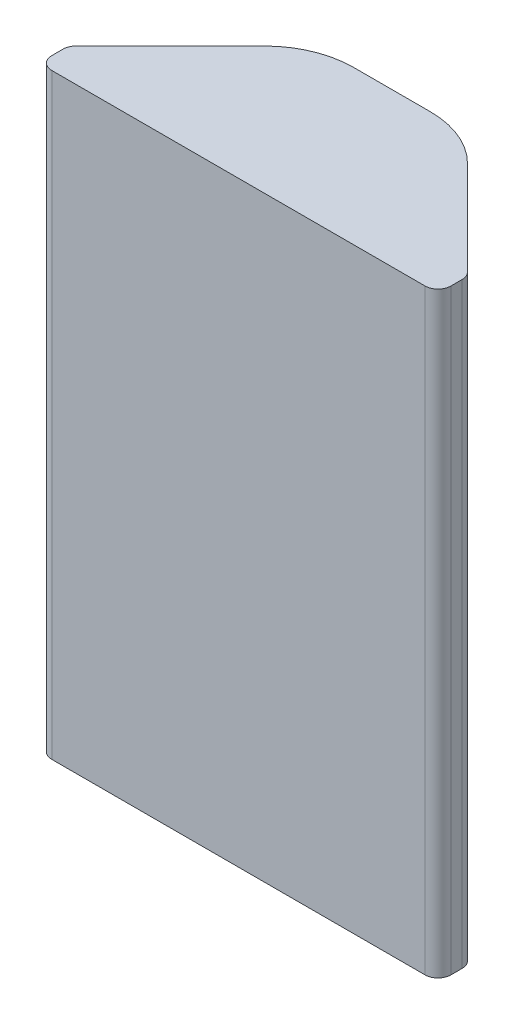
ISO-10303-21;
HEADER;
FILE_DESCRIPTION(('STEP AP214'),'2;1');
FILE_NAME('part.step','',(''),(''),'','','');
FILE_SCHEMA(('AUTOMOTIVE_DESIGN { 1 0 10303 214 1 1 1 1 }'));
ENDSEC;
DATA;
#1=APPLICATION_CONTEXT('core data for automotive mechanical design processes');
#2=APPLICATION_PROTOCOL_DEFINITION('international standard','automotive_design',2000,#1);
#3=PRODUCT_CONTEXT('',#1,'mechanical');
#4=PRODUCT('Part','Part','',(#3));
#5=PRODUCT_RELATED_PRODUCT_CATEGORY('part','',(#4));
#6=PRODUCT_DEFINITION_FORMATION('','',#4);
#7=PRODUCT_DEFINITION_CONTEXT('part definition',#1,'design');
#8=PRODUCT_DEFINITION('design','',#6,#7);
#9=PRODUCT_DEFINITION_SHAPE('','',#8);
#10=(LENGTH_UNIT() NAMED_UNIT(*) SI_UNIT(.MILLI.,.METRE.));
#11=(NAMED_UNIT(*) PLANE_ANGLE_UNIT() SI_UNIT($,.RADIAN.));
#12=(NAMED_UNIT(*) SI_UNIT($,.STERADIAN.) SOLID_ANGLE_UNIT());
#13=UNCERTAINTY_MEASURE_WITH_UNIT(LENGTH_MEASURE(1.E-05),#10,'distance_accuracy_value','');
#14=(GEOMETRIC_REPRESENTATION_CONTEXT(3) GLOBAL_UNCERTAINTY_ASSIGNED_CONTEXT((#13)) GLOBAL_UNIT_ASSIGNED_CONTEXT((#10,
#11,#12)) REPRESENTATION_CONTEXT('',''));
#15=CARTESIAN_POINT('',(0.,0.,0.));
#16=DIRECTION('',(0.,0.,1.));
#17=DIRECTION('',(1.,0.,0.));
#18=AXIS2_PLACEMENT_3D('',#15,#16,#17);
#19=CARTESIAN_POINT('',(9.38534251706032,15.,-4.96569999999972));
#20=DIRECTION('',(0.,-1.,0.));
#21=DIRECTION('',(0.,0.,-1.));
#22=AXIS2_PLACEMENT_3D('',#19,#20,#21);
#23=CYLINDRICAL_SURFACE('',#22,0.647699999999699);
#24=CARTESIAN_POINT('',(9.38534251706032,-15.,-4.96569999999972));
#25=DIRECTION('',(0.,1.,0.));
#26=DIRECTION('',(0.,0.,1.));
#27=AXIS2_PLACEMENT_3D('',#24,#25,#26);
#28=CIRCLE('',#27,0.647699999999699);
#29=CARTESIAN_POINT('',(9.38534251706002,-15.,-4.31800000000002));
#30=VERTEX_POINT('',#29);
#31=CARTESIAN_POINT('',(10.03304251706,-15.,-4.96569999999972));
#32=VERTEX_POINT('',#31);
#33=EDGE_CURVE('E154',#30,#32,#28,.T.);
#34=ORIENTED_EDGE('',*,*,#33,.T.);
#35=DIRECTION('',(0.,-1.,0.));
#36=VECTOR('',#35,1.);
#37=CARTESIAN_POINT('',(10.03304251706,15.,-4.96569999999972));
#38=LINE('',#37,#36);
#39=CARTESIAN_POINT('',(10.03304251706,15.,-4.96569999999972));
#40=VERTEX_POINT('',#39);
#41=EDGE_CURVE('E11',#40,#32,#38,.T.);
#42=ORIENTED_EDGE('',*,*,#41,.F.);
#43=CARTESIAN_POINT('',(9.38534251706032,15.,-4.96569999999972));
#44=DIRECTION('',(0.,1.,0.));
#45=DIRECTION('',(0.,0.,1.));
#46=AXIS2_PLACEMENT_3D('',#43,#44,#45);
#47=CIRCLE('',#46,0.647699999999699);
#48=CARTESIAN_POINT('',(9.38534251706002,15.,-4.31800000000002));
#49=VERTEX_POINT('',#48);
#50=EDGE_CURVE('E177',#49,#40,#47,.T.);
#51=ORIENTED_EDGE('',*,*,#50,.F.);
#52=DIRECTION('',(0.,-1.,0.));
#53=VECTOR('',#52,1.);
#54=CARTESIAN_POINT('',(9.38534251706002,15.,-4.31800000000002));
#55=LINE('',#54,#53);
#56=EDGE_CURVE('E150',#49,#30,#55,.T.);
#57=ORIENTED_EDGE('',*,*,#56,.T.);
#58=EDGE_LOOP('',(#34,#42,#51,#57));
#59=FACE_BOUND('',#58,.T.);
#60=ADVANCED_FACE('F33',(#59),#23,.T.);
#61=CARTESIAN_POINT('',(10.03304251706,15.,-5.53395791189082));
#62=DIRECTION('',(-1.,0.,0.));
#63=DIRECTION('',(0.,0.,1.));
#64=AXIS2_PLACEMENT_3D('',#61,#62,#63);
#65=PLANE('',#64);
#66=DIRECTION('',(0.,0.,-1.));
#67=VECTOR('',#66,1.);
#68=CARTESIAN_POINT('',(10.03304251706,-15.,-5.53395791189082));
#69=LINE('',#68,#67);
#70=CARTESIAN_POINT('',(10.03304251706,-15.,-5.53395791189082));
#71=VERTEX_POINT('',#70);
#72=EDGE_CURVE('E157',#32,#71,#69,.T.);
#73=ORIENTED_EDGE('',*,*,#72,.T.);
#74=DIRECTION('',(0.,-1.,0.));
#75=VECTOR('',#74,1.);
#76=CARTESIAN_POINT('',(10.03304251706,15.,-5.53395791189082));
#77=LINE('',#76,#75);
#78=CARTESIAN_POINT('',(10.03304251706,15.,-5.53395791189082));
#79=VERTEX_POINT('',#78);
#80=EDGE_CURVE('E41',#79,#71,#77,.T.);
#81=ORIENTED_EDGE('',*,*,#80,.F.);
#82=DIRECTION('',(0.,0.,-1.));
#83=VECTOR('',#82,1.);
#84=CARTESIAN_POINT('',(10.03304251706,15.,-5.53395791189082));
#85=LINE('',#84,#83);
#86=EDGE_CURVE('E102',#40,#79,#85,.T.);
#87=ORIENTED_EDGE('',*,*,#86,.F.);
#88=ORIENTED_EDGE('',*,*,#41,.T.);
#89=EDGE_LOOP('',(#73,#81,#87,#88));
#90=FACE_BOUND('',#89,.T.);
#91=ADVANCED_FACE('F245',(#90),#65,.F.);
#92=CARTESIAN_POINT('',(9.38534251706399,15.,-5.53395791189082));
#93=DIRECTION('',(0.,-1.,0.));
#94=DIRECTION('',(0.,0.,-1.));
#95=AXIS2_PLACEMENT_3D('',#92,#93,#94);
#96=CYLINDRICAL_SURFACE('',#95,0.64769999999602);
#97=CARTESIAN_POINT('',(9.38534251706399,-15.,-5.53395791189082));
#98=DIRECTION('',(0.,1.,0.));
#99=DIRECTION('',(0.,0.,1.));
#100=AXIS2_PLACEMENT_3D('',#97,#98,#99);
#101=CIRCLE('',#100,0.64769999999602);
#102=CARTESIAN_POINT('',(9.84333501601026,-15.,-5.99195153728729));
#103=VERTEX_POINT('',#102);
#104=EDGE_CURVE('E159',#71,#103,#101,.T.);
#105=ORIENTED_EDGE('',*,*,#104,.T.);
#106=DIRECTION('',(0.,-1.,0.));
#107=VECTOR('',#106,1.);
#108=CARTESIAN_POINT('',(9.84333501601026,15.,-5.99195153728729));
#109=LINE('',#108,#107);
#110=CARTESIAN_POINT('',(9.84333501601026,15.,-5.99195153728729));
#111=VERTEX_POINT('',#110);
#112=EDGE_CURVE('E196',#111,#103,#109,.T.);
#113=ORIENTED_EDGE('',*,*,#112,.F.);
#114=CARTESIAN_POINT('',(9.38534251706399,15.,-5.53395791189082));
#115=DIRECTION('',(0.,1.,0.));
#116=DIRECTION('',(0.,0.,1.));
#117=AXIS2_PLACEMENT_3D('',#114,#115,#116);
#118=CIRCLE('',#117,0.64769999999602);
#119=EDGE_CURVE('E204',#79,#111,#118,.T.);
#120=ORIENTED_EDGE('',*,*,#119,.F.);
#121=ORIENTED_EDGE('',*,*,#80,.T.);
#122=EDGE_LOOP('',(#105,#113,#120,#121));
#123=FACE_BOUND('',#122,.T.);
#124=ADVANCED_FACE('F202',(#123),#96,.T.);
#125=CARTESIAN_POINT('',(5.11246034125617,15.,-10.7228145763014));
#126=DIRECTION('',(-0.707105911608889,0.,0.707107650763137));
#127=DIRECTION('',(0.707107650763137,0.,0.707105911608889));
#128=AXIS2_PLACEMENT_3D('',#125,#126,#127);
#129=PLANE('',#128);
#130=DIRECTION('',(-0.707107650763137,0.,-0.707105911608889));
#131=VECTOR('',#130,1.);
#132=CARTESIAN_POINT('',(5.11246034125617,-15.,-10.7228145763014));
#133=LINE('',#132,#131);
#134=CARTESIAN_POINT('',(5.11246034125617,-15.,-10.7228145763014));
#135=VERTEX_POINT('',#134);
#136=EDGE_CURVE('E161',#103,#135,#133,.T.);
#137=ORIENTED_EDGE('',*,*,#136,.T.);
#138=DIRECTION('',(0.,-1.,0.));
#139=VECTOR('',#138,1.);
#140=CARTESIAN_POINT('',(5.11246034125617,15.,-10.7228145763014));
#141=LINE('',#140,#139);
#142=CARTESIAN_POINT('',(5.11246034125617,15.,-10.7228145763014));
#143=VERTEX_POINT('',#142);
#144=EDGE_CURVE('E193',#143,#135,#141,.T.);
#145=ORIENTED_EDGE('',*,*,#144,.F.);
#146=DIRECTION('',(-0.707107650763137,0.,-0.707105911608889));
#147=VECTOR('',#146,1.);
#148=CARTESIAN_POINT('',(5.11246034125617,15.,-10.7228145763014));
#149=LINE('',#148,#147);
#150=EDGE_CURVE('E220',#111,#143,#149,.T.);
#151=ORIENTED_EDGE('',*,*,#150,.F.);
#152=ORIENTED_EDGE('',*,*,#112,.T.);
#153=EDGE_LOOP('',(#137,#145,#151,#152));
#154=FACE_BOUND('',#153,.T.);
#155=ADVANCED_FACE('F211',(#154),#129,.F.);
#156=CARTESIAN_POINT('',(1.93345358384597,15.,-7.5438000000015));
#157=DIRECTION('',(0.,-1.,0.));
#158=DIRECTION('',(0.,0.,-1.));
#159=AXIS2_PLACEMENT_3D('',#156,#157,#158);
#160=CYLINDRICAL_SURFACE('',#159,4.49579999999852);
#161=CARTESIAN_POINT('',(1.93345358384597,-15.,-7.5438000000015));
#162=DIRECTION('',(0.,1.,0.));
#163=DIRECTION('',(0.,0.,1.));
#164=AXIS2_PLACEMENT_3D('',#161,#162,#163);
#165=CIRCLE('',#164,4.49579999999852);
#166=CARTESIAN_POINT('',(1.93345358384597,-15.,-12.0396));
#167=VERTEX_POINT('',#166);
#168=EDGE_CURVE('E163',#135,#167,#165,.T.);
#169=ORIENTED_EDGE('',*,*,#168,.T.);
#170=DIRECTION('',(0.,-1.,0.));
#171=VECTOR('',#170,1.);
#172=CARTESIAN_POINT('',(1.93345358384597,15.,-12.0396));
#173=LINE('',#172,#171);
#174=CARTESIAN_POINT('',(1.93345358384597,15.,-12.0396));
#175=VERTEX_POINT('',#174);
#176=EDGE_CURVE('E190',#175,#167,#173,.T.);
#177=ORIENTED_EDGE('',*,*,#176,.F.);
#178=CARTESIAN_POINT('',(1.93345358384597,15.,-7.5438000000015));
#179=DIRECTION('',(0.,1.,0.));
#180=DIRECTION('',(0.,0.,1.));
#181=AXIS2_PLACEMENT_3D('',#178,#179,#180);
#182=CIRCLE('',#181,4.49579999999852);
#183=EDGE_CURVE('E217',#143,#175,#182,.T.);
#184=ORIENTED_EDGE('',*,*,#183,.F.);
#185=ORIENTED_EDGE('',*,*,#144,.T.);
#186=EDGE_LOOP('',(#169,#177,#184,#185));
#187=FACE_BOUND('',#186,.T.);
#188=ADVANCED_FACE('F215',(#187),#160,.T.);
#189=CARTESIAN_POINT('',(-1.93345358384594,15.,-12.0396));
#190=DIRECTION('',(0.,0.,1.));
#191=DIRECTION('',(1.,0.,0.));
#192=AXIS2_PLACEMENT_3D('',#189,#190,#191);
#193=PLANE('',#192);
#194=DIRECTION('',(-1.,0.,0.));
#195=VECTOR('',#194,1.);
#196=CARTESIAN_POINT('',(-1.93345358384594,-15.,-12.0396));
#197=LINE('',#196,#195);
#198=CARTESIAN_POINT('',(-1.93345358384594,-15.,-12.0396));
#199=VERTEX_POINT('',#198);
#200=EDGE_CURVE('E165',#167,#199,#197,.T.);
#201=ORIENTED_EDGE('',*,*,#200,.T.);
#202=DIRECTION('',(0.,-1.,0.));
#203=VECTOR('',#202,1.);
#204=CARTESIAN_POINT('',(-1.93345358384594,15.,-12.0396));
#205=LINE('',#204,#203);
#206=CARTESIAN_POINT('',(-1.93345358384594,15.,-12.0396));
#207=VERTEX_POINT('',#206);
#208=EDGE_CURVE('E187',#207,#199,#205,.T.);
#209=ORIENTED_EDGE('',*,*,#208,.F.);
#210=DIRECTION('',(-1.,0.,0.));
#211=VECTOR('',#210,1.);
#212=CARTESIAN_POINT('',(-1.93345358384594,15.,-12.0396));
#213=LINE('',#212,#211);
#214=EDGE_CURVE('E219',#175,#207,#213,.T.);
#215=ORIENTED_EDGE('',*,*,#214,.F.);
#216=ORIENTED_EDGE('',*,*,#176,.T.);
#217=EDGE_LOOP('',(#201,#209,#215,#216));
#218=FACE_BOUND('',#217,.T.);
#219=ADVANCED_FACE('F257',(#218),#193,.F.);
#220=CARTESIAN_POINT('',(-1.93345358384594,15.,-7.54380000000146));
#221=DIRECTION('',(0.,-1.,0.));
#222=DIRECTION('',(0.,0.,-1.));
#223=AXIS2_PLACEMENT_3D('',#220,#221,#222);
#224=CYLINDRICAL_SURFACE('',#223,4.49579999999856);
#225=CARTESIAN_POINT('',(-1.93345358384594,-15.,-7.54380000000146));
#226=DIRECTION('',(0.,1.,0.));
#227=DIRECTION('',(0.,0.,1.));
#228=AXIS2_PLACEMENT_3D('',#225,#226,#227);
#229=CIRCLE('',#228,4.49579999999856);
#230=CARTESIAN_POINT('',(-5.11246034125617,-15.,-10.7228145763013));
#231=VERTEX_POINT('',#230);
#232=EDGE_CURVE('E167',#199,#231,#229,.T.);
#233=ORIENTED_EDGE('',*,*,#232,.T.);
#234=DIRECTION('',(0.,-1.,0.));
#235=VECTOR('',#234,1.);
#236=CARTESIAN_POINT('',(-5.11246034125617,15.,-10.7228145763013));
#237=LINE('',#236,#235);
#238=CARTESIAN_POINT('',(-5.11246034125617,15.,-10.7228145763013));
#239=VERTEX_POINT('',#238);
#240=EDGE_CURVE('E184',#239,#231,#237,.T.);
#241=ORIENTED_EDGE('',*,*,#240,.F.);
#242=CARTESIAN_POINT('',(-1.93345358384594,15.,-7.54380000000146));
#243=DIRECTION('',(0.,1.,0.));
#244=DIRECTION('',(0.,0.,1.));
#245=AXIS2_PLACEMENT_3D('',#242,#243,#244);
#246=CIRCLE('',#245,4.49579999999856);
#247=EDGE_CURVE('E222',#207,#239,#246,.T.);
#248=ORIENTED_EDGE('',*,*,#247,.F.);
#249=ORIENTED_EDGE('',*,*,#208,.T.);
#250=EDGE_LOOP('',(#233,#241,#248,#249));
#251=FACE_BOUND('',#250,.T.);
#252=ADVANCED_FACE('F260',(#251),#224,.T.);
#253=CARTESIAN_POINT('',(-9.84333501601023,15.,-5.99195153728728));
#254=DIRECTION('',(0.707105911608891,0.,0.707107650763135));
#255=DIRECTION('',(0.707107650763135,0.,-0.707105911608891));
#256=AXIS2_PLACEMENT_3D('',#253,#254,#255);
#257=PLANE('',#256);
#258=DIRECTION('',(-0.707107650763135,0.,0.707105911608891));
#259=VECTOR('',#258,1.);
#260=CARTESIAN_POINT('',(-9.84333501601023,-15.,-5.99195153728728));
#261=LINE('',#260,#259);
#262=CARTESIAN_POINT('',(-9.84333501601023,-15.,-5.99195153728728));
#263=VERTEX_POINT('',#262);
#264=EDGE_CURVE('E169',#231,#263,#261,.T.);
#265=ORIENTED_EDGE('',*,*,#264,.T.);
#266=DIRECTION('',(0.,-1.,0.));
#267=VECTOR('',#266,1.);
#268=CARTESIAN_POINT('',(-9.84333501601023,15.,-5.99195153728728));
#269=LINE('',#268,#267);
#270=CARTESIAN_POINT('',(-9.84333501601023,15.,-5.99195153728728));
#271=VERTEX_POINT('',#270);
#272=EDGE_CURVE('E181',#271,#263,#269,.T.);
#273=ORIENTED_EDGE('',*,*,#272,.F.);
#274=DIRECTION('',(-0.707107650763135,0.,0.707105911608891));
#275=VECTOR('',#274,1.);
#276=CARTESIAN_POINT('',(-9.84333501601023,15.,-5.99195153728728));
#277=LINE('',#276,#275);
#278=EDGE_CURVE('E228',#239,#271,#277,.T.);
#279=ORIENTED_EDGE('',*,*,#278,.F.);
#280=ORIENTED_EDGE('',*,*,#240,.T.);
#281=EDGE_LOOP('',(#265,#273,#279,#280));
#282=FACE_BOUND('',#281,.T.);
#283=ADVANCED_FACE('F234',(#282),#257,.F.);
#284=CARTESIAN_POINT('',(-9.38534251706396,15.,-5.53395791189082));
#285=DIRECTION('',(0.,-1.,0.));
#286=DIRECTION('',(0.,0.,-1.));
#287=AXIS2_PLACEMENT_3D('',#284,#285,#286);
#288=CYLINDRICAL_SURFACE('',#287,0.647699999996017);
#289=CARTESIAN_POINT('',(-9.38534251706396,-15.,-5.53395791189082));
#290=DIRECTION('',(0.,1.,0.));
#291=DIRECTION('',(0.,0.,1.));
#292=AXIS2_PLACEMENT_3D('',#289,#290,#291);
#293=CIRCLE('',#292,0.647699999996017);
#294=CARTESIAN_POINT('',(-10.03304251706,-15.,-5.53395791189082));
#295=VERTEX_POINT('',#294);
#296=EDGE_CURVE('E171',#263,#295,#293,.T.);
#297=ORIENTED_EDGE('',*,*,#296,.T.);
#298=DIRECTION('',(0.,-1.,0.));
#299=VECTOR('',#298,1.);
#300=CARTESIAN_POINT('',(-10.03304251706,15.,-5.53395791189082));
#301=LINE('',#300,#299);
#302=CARTESIAN_POINT('',(-10.03304251706,15.,-5.53395791189082));
#303=VERTEX_POINT('',#302);
#304=EDGE_CURVE('E145',#303,#295,#301,.T.);
#305=ORIENTED_EDGE('',*,*,#304,.F.);
#306=CARTESIAN_POINT('',(-9.38534251706396,15.,-5.53395791189082));
#307=DIRECTION('',(0.,1.,0.));
#308=DIRECTION('',(0.,0.,1.));
#309=AXIS2_PLACEMENT_3D('',#306,#307,#308);
#310=CIRCLE('',#309,0.647699999996017);
#311=EDGE_CURVE('E134',#271,#303,#310,.T.);
#312=ORIENTED_EDGE('',*,*,#311,.F.);
#313=ORIENTED_EDGE('',*,*,#272,.T.);
#314=EDGE_LOOP('',(#297,#305,#312,#313));
#315=FACE_BOUND('',#314,.T.);
#316=ADVANCED_FACE('F238',(#315),#288,.T.);
#317=CARTESIAN_POINT('',(-10.03304251706,15.,-4.96570000000002));
#318=DIRECTION('',(1.,0.,0.));
#319=DIRECTION('',(0.,0.,-1.));
#320=AXIS2_PLACEMENT_3D('',#317,#318,#319);
#321=PLANE('',#320);
#322=DIRECTION('',(0.,0.,1.));
#323=VECTOR('',#322,1.);
#324=CARTESIAN_POINT('',(-10.03304251706,-15.,-4.96570000000002));
#325=LINE('',#324,#323);
#326=CARTESIAN_POINT('',(-10.03304251706,-15.,-4.96570000000002));
#327=VERTEX_POINT('',#326);
#328=EDGE_CURVE('E143',#295,#327,#325,.T.);
#329=ORIENTED_EDGE('',*,*,#328,.T.);
#330=DIRECTION('',(0.,-1.,0.));
#331=VECTOR('',#330,1.);
#332=CARTESIAN_POINT('',(-10.03304251706,15.,-4.96570000000002));
#333=LINE('',#332,#331);
#334=CARTESIAN_POINT('',(-10.03304251706,15.,-4.96570000000002));
#335=VERTEX_POINT('',#334);
#336=EDGE_CURVE('E140',#335,#327,#333,.T.);
#337=ORIENTED_EDGE('',*,*,#336,.F.);
#338=DIRECTION('',(0.,0.,1.));
#339=VECTOR('',#338,1.);
#340=CARTESIAN_POINT('',(-10.03304251706,15.,-4.96570000000002));
#341=LINE('',#340,#339);
#342=EDGE_CURVE('E127',#303,#335,#341,.T.);
#343=ORIENTED_EDGE('',*,*,#342,.F.);
#344=ORIENTED_EDGE('',*,*,#304,.T.);
#345=EDGE_LOOP('',(#329,#337,#343,#344));
#346=FACE_BOUND('',#345,.T.);
#347=ADVANCED_FACE('F141',(#346),#321,.F.);
#348=CARTESIAN_POINT('',(-9.38534251706029,15.,-4.96569999999972));
#349=DIRECTION('',(0.,-1.,0.));
#350=DIRECTION('',(0.,0.,-1.));
#351=AXIS2_PLACEMENT_3D('',#348,#349,#350);
#352=CYLINDRICAL_SURFACE('',#351,0.647699999999692);
#353=CARTESIAN_POINT('',(-9.38534251706029,-15.,-4.96569999999972));
#354=DIRECTION('',(0.,1.,0.));
#355=DIRECTION('',(0.,0.,1.));
#356=AXIS2_PLACEMENT_3D('',#353,#354,#355);
#357=CIRCLE('',#356,0.647699999999692);
#358=CARTESIAN_POINT('',(-9.38534251706007,-15.,-4.31800000000002));
#359=VERTEX_POINT('',#358);
#360=EDGE_CURVE('E174',#327,#359,#357,.T.);
#361=ORIENTED_EDGE('',*,*,#360,.T.);
#362=DIRECTION('',(0.,-1.,0.));
#363=VECTOR('',#362,1.);
#364=CARTESIAN_POINT('',(-9.38534251706007,15.,-4.31800000000002));
#365=LINE('',#364,#363);
#366=CARTESIAN_POINT('',(-9.38534251706007,15.,-4.31800000000002));
#367=VERTEX_POINT('',#366);
#368=EDGE_CURVE('E146',#367,#359,#365,.T.);
#369=ORIENTED_EDGE('',*,*,#368,.F.);
#370=CARTESIAN_POINT('',(-9.38534251706029,15.,-4.96569999999972));
#371=DIRECTION('',(0.,1.,0.));
#372=DIRECTION('',(0.,0.,1.));
#373=AXIS2_PLACEMENT_3D('',#370,#371,#372);
#374=CIRCLE('',#373,0.647699999999692);
#375=EDGE_CURVE('E131',#335,#367,#374,.T.);
#376=ORIENTED_EDGE('',*,*,#375,.F.);
#377=ORIENTED_EDGE('',*,*,#336,.T.);
#378=EDGE_LOOP('',(#361,#369,#376,#377));
#379=FACE_BOUND('',#378,.T.);
#380=ADVANCED_FACE('F148',(#379),#352,.T.);
#381=CARTESIAN_POINT('',(9.38534251706002,15.,-4.31800000000002));
#382=DIRECTION('',(0.,0.,-1.));
#383=DIRECTION('',(-1.,0.,0.));
#384=AXIS2_PLACEMENT_3D('',#381,#382,#383);
#385=PLANE('',#384);
#386=DIRECTION('',(1.,0.,0.));
#387=VECTOR('',#386,1.);
#388=CARTESIAN_POINT('',(9.38534251706002,-15.,-4.31800000000002));
#389=LINE('',#388,#387);
#390=EDGE_CURVE('E90',#359,#30,#389,.T.);
#391=ORIENTED_EDGE('',*,*,#390,.T.);
#392=ORIENTED_EDGE('',*,*,#56,.F.);
#393=DIRECTION('',(1.,0.,0.));
#394=VECTOR('',#393,1.);
#395=CARTESIAN_POINT('',(-5.61761754927763,15.,-4.31800000000002));
#396=LINE('',#395,#394);
#397=EDGE_CURVE('E49',#367,#49,#396,.T.);
#398=ORIENTED_EDGE('',*,*,#397,.F.);
#399=ORIENTED_EDGE('',*,*,#368,.T.);
#400=EDGE_LOOP('',(#391,#392,#398,#399));
#401=FACE_BOUND('',#400,.T.);
#402=ADVANCED_FACE('F239',(#401),#385,.F.);
#403=CARTESIAN_POINT('',(9.38534251706032,15.,-4.96569999999972));
#404=DIRECTION('',(0.,1.,0.));
#405=DIRECTION('',(0.,0.,1.));
#406=AXIS2_PLACEMENT_3D('',#403,#404,#405);
#407=PLANE('',#406);
#408=ORIENTED_EDGE('',*,*,#50,.T.);
#409=ORIENTED_EDGE('',*,*,#86,.T.);
#410=ORIENTED_EDGE('',*,*,#119,.T.);
#411=ORIENTED_EDGE('',*,*,#150,.T.);
#412=ORIENTED_EDGE('',*,*,#183,.T.);
#413=ORIENTED_EDGE('',*,*,#214,.T.);
#414=ORIENTED_EDGE('',*,*,#247,.T.);
#415=ORIENTED_EDGE('',*,*,#278,.T.);
#416=ORIENTED_EDGE('',*,*,#311,.T.);
#417=ORIENTED_EDGE('',*,*,#342,.T.);
#418=ORIENTED_EDGE('',*,*,#375,.T.);
#419=ORIENTED_EDGE('',*,*,#397,.T.);
#420=EDGE_LOOP('',(#408,#409,#410,#411,#412,#413,#414,#415,#416,#417,#418,#419));
#421=FACE_BOUND('',#420,.T.);
#422=ADVANCED_FACE('F129',(#421),#407,.T.);
#423=CARTESIAN_POINT('',(9.38534251706032,-15.,-4.96569999999972));
#424=DIRECTION('',(0.,1.,0.));
#425=DIRECTION('',(0.,0.,1.));
#426=AXIS2_PLACEMENT_3D('',#423,#424,#425);
#427=PLANE('',#426);
#428=ORIENTED_EDGE('',*,*,#33,.F.);
#429=ORIENTED_EDGE('',*,*,#390,.F.);
#430=ORIENTED_EDGE('',*,*,#360,.F.);
#431=ORIENTED_EDGE('',*,*,#328,.F.);
#432=ORIENTED_EDGE('',*,*,#296,.F.);
#433=ORIENTED_EDGE('',*,*,#264,.F.);
#434=ORIENTED_EDGE('',*,*,#232,.F.);
#435=ORIENTED_EDGE('',*,*,#200,.F.);
#436=ORIENTED_EDGE('',*,*,#168,.F.);
#437=ORIENTED_EDGE('',*,*,#136,.F.);
#438=ORIENTED_EDGE('',*,*,#104,.F.);
#439=ORIENTED_EDGE('',*,*,#72,.F.);
#440=EDGE_LOOP('',(#428,#429,#430,#431,#432,#433,#434,#435,#436,#437,#438,#439));
#441=FACE_BOUND('',#440,.T.);
#442=ADVANCED_FACE('F206',(#441),#427,.F.);
#443=CLOSED_SHELL('',(#60,#91,#124,#155,#188,#219,#252,#283,#316,#347,#380,#402,#422,#442));
#444=MANIFOLD_SOLID_BREP('B2',#443);
#445=ADVANCED_BREP_SHAPE_REPRESENTATION('',(#18,#444),#14);
#446=SHAPE_DEFINITION_REPRESENTATION(#9,#445);
ENDSEC;
END-ISO-10303-21;
